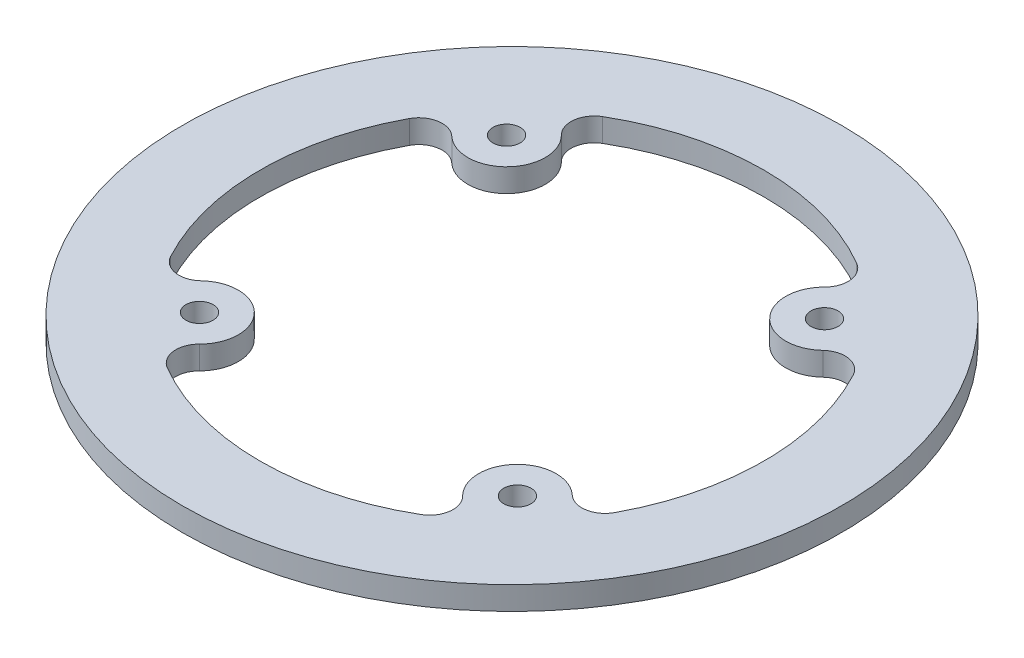
ISO-10303-21;
HEADER;
FILE_DESCRIPTION(('STEP AP214'),'2;1');
FILE_NAME('part.step','',(''),(''),'','','');
FILE_SCHEMA(('AUTOMOTIVE_DESIGN { 1 0 10303 214 1 1 1 1 }'));
ENDSEC;
DATA;
#1=APPLICATION_CONTEXT('core data for automotive mechanical design processes');
#2=APPLICATION_PROTOCOL_DEFINITION('international standard','automotive_design',2000,#1);
#3=PRODUCT_CONTEXT('',#1,'mechanical');
#4=PRODUCT('Part','Part','',(#3));
#5=PRODUCT_RELATED_PRODUCT_CATEGORY('part','',(#4));
#6=PRODUCT_DEFINITION_FORMATION('','',#4);
#7=PRODUCT_DEFINITION_CONTEXT('part definition',#1,'design');
#8=PRODUCT_DEFINITION('design','',#6,#7);
#9=PRODUCT_DEFINITION_SHAPE('','',#8);
#10=(LENGTH_UNIT() NAMED_UNIT(*) SI_UNIT(.MILLI.,.METRE.));
#11=(NAMED_UNIT(*) PLANE_ANGLE_UNIT() SI_UNIT($,.RADIAN.));
#12=(NAMED_UNIT(*) SI_UNIT($,.STERADIAN.) SOLID_ANGLE_UNIT());
#13=UNCERTAINTY_MEASURE_WITH_UNIT(LENGTH_MEASURE(1.E-05),#10,'distance_accuracy_value','');
#14=(GEOMETRIC_REPRESENTATION_CONTEXT(3) GLOBAL_UNCERTAINTY_ASSIGNED_CONTEXT((#13)) GLOBAL_UNIT_ASSIGNED_CONTEXT((#10,
#11,#12)) REPRESENTATION_CONTEXT('',''));
#15=CARTESIAN_POINT('',(0.,0.,0.));
#16=DIRECTION('',(0.,0.,1.));
#17=DIRECTION('',(1.,0.,0.));
#18=AXIS2_PLACEMENT_3D('',#15,#16,#17);
#19=CARTESIAN_POINT('',(0.,3.,0.));
#20=DIRECTION('',(0.,1.,0.));
#21=DIRECTION('',(0.,0.,1.));
#22=AXIS2_PLACEMENT_3D('',#19,#20,#21);
#23=PLANE('',#22);
#24=CARTESIAN_POINT('',(20.5,3.,-19.7989898732233));
#25=DIRECTION('',(0.,1.,0.));
#26=DIRECTION('',(0.,0.,1.));
#27=AXIS2_PLACEMENT_3D('',#24,#25,#26);
#28=CIRCLE('',#27,1.75);
#29=CARTESIAN_POINT('',(20.5,3.,-18.0489898732233));
#30=VERTEX_POINT('',#29);
#31=EDGE_CURVE('E267',#30,#30,#28,.T.);
#32=ORIENTED_EDGE('',*,*,#31,.F.);
#33=EDGE_LOOP('',(#32));
#34=FACE_BOUND('',#33,.T.);
#35=CARTESIAN_POINT('',(-20.5,3.,19.7989898732233));
#36=DIRECTION('',(0.,1.,0.));
#37=DIRECTION('',(0.,0.,1.));
#38=AXIS2_PLACEMENT_3D('',#35,#36,#37);
#39=CIRCLE('',#38,1.75);
#40=CARTESIAN_POINT('',(-20.5,3.,21.5489898732233));
#41=VERTEX_POINT('',#40);
#42=EDGE_CURVE('E252',#41,#41,#39,.T.);
#43=ORIENTED_EDGE('',*,*,#42,.F.);
#44=EDGE_LOOP('',(#43));
#45=FACE_BOUND('',#44,.T.);
#46=CARTESIAN_POINT('',(0.,3.,0.));
#47=DIRECTION('',(0.,1.,0.));
#48=DIRECTION('',(0.,0.,1.));
#49=AXIS2_PLACEMENT_3D('',#46,#47,#48);
#50=CIRCLE('',#49,42.5);
#51=CARTESIAN_POINT('',(0.,3.,42.5));
#52=VERTEX_POINT('',#51);
#53=EDGE_CURVE('E182',#52,#52,#50,.T.);
#54=ORIENTED_EDGE('',*,*,#53,.T.);
#55=EDGE_LOOP('',(#54));
#56=FACE_BOUND('',#55,.T.);
#57=CARTESIAN_POINT('',(20.5,3.,19.7989898732233));
#58=DIRECTION('',(0.,1.,0.));
#59=DIRECTION('',(0.,0.,1.));
#60=AXIS2_PLACEMENT_3D('',#57,#58,#59);
#61=CIRCLE('',#60,1.75);
#62=CARTESIAN_POINT('',(20.5,3.,21.5489898732233));
#63=VERTEX_POINT('',#62);
#64=EDGE_CURVE('E258',#63,#63,#61,.T.);
#65=ORIENTED_EDGE('',*,*,#64,.F.);
#66=EDGE_LOOP('',(#65));
#67=FACE_BOUND('',#66,.T.);
#68=CARTESIAN_POINT('',(-20.5,3.,-19.7989898732233));
#69=DIRECTION('',(0.,1.,0.));
#70=DIRECTION('',(0.,0.,1.));
#71=AXIS2_PLACEMENT_3D('',#68,#69,#70);
#72=CIRCLE('',#71,1.75);
#73=CARTESIAN_POINT('',(-20.5,3.,-18.0489898732233));
#74=VERTEX_POINT('',#73);
#75=EDGE_CURVE('E259',#74,#74,#72,.T.);
#76=ORIENTED_EDGE('',*,*,#75,.F.);
#77=EDGE_LOOP('',(#76));
#78=FACE_BOUND('',#77,.T.);
#79=CARTESIAN_POINT('',(0.,3.,0.));
#80=DIRECTION('',(0.,1.,0.));
#81=DIRECTION('',(0.,0.,1.));
#82=AXIS2_PLACEMENT_3D('',#79,#80,#81);
#83=CIRCLE('',#82,32.5);
#84=CARTESIAN_POINT('',(16.3790683172023,3.,-28.0709123660137));
#85=VERTEX_POINT('',#84);
#86=CARTESIAN_POINT('',(-16.3790683172023,3.,-28.0709123660137));
#87=VERTEX_POINT('',#86);
#88=EDGE_CURVE('E166',#85,#87,#83,.T.);
#89=ORIENTED_EDGE('',*,*,#88,.F.);
#90=CARTESIAN_POINT('',(14.8671543186913,3.,-25.4797512245355));
#91=DIRECTION('',(0.,1.,0.));
#92=DIRECTION('',(0.,0.,1.));
#93=AXIS2_PLACEMENT_3D('',#90,#91,#92);
#94=CIRCLE('',#93,3.);
#95=CARTESIAN_POINT('',(16.9794714491821,3.,-23.3494657177934));
#96=VERTEX_POINT('',#95);
#97=EDGE_CURVE('E163',#85,#96,#94,.F.);
#98=ORIENTED_EDGE('',*,*,#97,.T.);
#99=CARTESIAN_POINT('',(20.5,3.,-19.7989898732233));
#100=DIRECTION('',(0.,1.,0.));
#101=DIRECTION('',(0.,0.,1.));
#102=AXIS2_PLACEMENT_3D('',#99,#100,#101);
#103=CIRCLE('',#102,5.);
#104=CARTESIAN_POINT('',(23.9258840448161,3.,-16.1571059498295));
#105=VERTEX_POINT('',#104);
#106=EDGE_CURVE('E165',#96,#105,#103,.T.);
#107=ORIENTED_EDGE('',*,*,#106,.T.);
#108=CARTESIAN_POINT('',(25.9814144717057,3.,-13.9719755957932));
#109=DIRECTION('',(0.,1.,0.));
#110=DIRECTION('',(0.,0.,1.));
#111=AXIS2_PLACEMENT_3D('',#108,#109,#110);
#112=CIRCLE('',#111,3.);
#113=CARTESIAN_POINT('',(28.6235922145911,3.,-15.3928544699416));
#114=VERTEX_POINT('',#113);
#115=EDGE_CURVE('E225',#105,#114,#112,.F.);
#116=ORIENTED_EDGE('',*,*,#115,.T.);
#117=CARTESIAN_POINT('',(28.6235922145911,3.,15.3928544699416));
#118=VERTEX_POINT('',#117);
#119=EDGE_CURVE('E349',#118,#114,#83,.T.);
#120=ORIENTED_EDGE('',*,*,#119,.F.);
#121=CARTESIAN_POINT('',(25.9814144717057,3.,13.9719755957932));
#122=DIRECTION('',(0.,1.,0.));
#123=DIRECTION('',(0.,0.,1.));
#124=AXIS2_PLACEMENT_3D('',#121,#122,#123);
#125=CIRCLE('',#124,3.);
#126=CARTESIAN_POINT('',(23.9258840448161,3.,16.1571059498295));
#127=VERTEX_POINT('',#126);
#128=EDGE_CURVE('E229',#118,#127,#125,.F.);
#129=ORIENTED_EDGE('',*,*,#128,.T.);
#130=CARTESIAN_POINT('',(20.5,3.,19.7989898732233));
#131=DIRECTION('',(0.,1.,0.));
#132=DIRECTION('',(0.,0.,1.));
#133=AXIS2_PLACEMENT_3D('',#130,#131,#132);
#134=CIRCLE('',#133,5.);
#135=CARTESIAN_POINT('',(16.9794714491821,3.,23.3494657177934));
#136=VERTEX_POINT('',#135);
#137=EDGE_CURVE('E190',#127,#136,#134,.T.);
#138=ORIENTED_EDGE('',*,*,#137,.T.);
#139=CARTESIAN_POINT('',(14.8671543186913,3.,25.4797512245355));
#140=DIRECTION('',(0.,1.,0.));
#141=DIRECTION('',(0.,0.,1.));
#142=AXIS2_PLACEMENT_3D('',#139,#140,#141);
#143=CIRCLE('',#142,3.);
#144=CARTESIAN_POINT('',(16.3790683172023,3.,28.0709123660137));
#145=VERTEX_POINT('',#144);
#146=EDGE_CURVE('E233',#136,#145,#143,.F.);
#147=ORIENTED_EDGE('',*,*,#146,.T.);
#148=CARTESIAN_POINT('',(-16.3790683172023,3.,28.0709123660137));
#149=VERTEX_POINT('',#148);
#150=EDGE_CURVE('E356',#149,#145,#83,.T.);
#151=ORIENTED_EDGE('',*,*,#150,.F.);
#152=CARTESIAN_POINT('',(-14.8671543186913,3.,25.4797512245355));
#153=DIRECTION('',(0.,1.,0.));
#154=DIRECTION('',(0.,0.,1.));
#155=AXIS2_PLACEMENT_3D('',#152,#153,#154);
#156=CIRCLE('',#155,3.);
#157=CARTESIAN_POINT('',(-16.9794714491821,3.,23.3494657177934));
#158=VERTEX_POINT('',#157);
#159=EDGE_CURVE('E237',#149,#158,#156,.F.);
#160=ORIENTED_EDGE('',*,*,#159,.T.);
#161=CARTESIAN_POINT('',(-20.5,3.,19.7989898732233));
#162=DIRECTION('',(0.,1.,0.));
#163=DIRECTION('',(0.,0.,1.));
#164=AXIS2_PLACEMENT_3D('',#161,#162,#163);
#165=CIRCLE('',#164,5.);
#166=CARTESIAN_POINT('',(-23.9258840448161,3.,16.1571059498295));
#167=VERTEX_POINT('',#166);
#168=EDGE_CURVE('E370',#158,#167,#165,.T.);
#169=ORIENTED_EDGE('',*,*,#168,.T.);
#170=CARTESIAN_POINT('',(-25.9814144717057,3.,13.9719755957932));
#171=DIRECTION('',(0.,1.,0.));
#172=DIRECTION('',(0.,0.,1.));
#173=AXIS2_PLACEMENT_3D('',#170,#171,#172);
#174=CIRCLE('',#173,3.);
#175=CARTESIAN_POINT('',(-28.6235922145911,3.,15.3928544699416));
#176=VERTEX_POINT('',#175);
#177=EDGE_CURVE('E241',#167,#176,#174,.F.);
#178=ORIENTED_EDGE('',*,*,#177,.T.);
#179=CARTESIAN_POINT('',(-28.6235922145911,3.,-15.3928544699416));
#180=VERTEX_POINT('',#179);
#181=EDGE_CURVE('E368',#180,#176,#83,.T.);
#182=ORIENTED_EDGE('',*,*,#181,.F.);
#183=CARTESIAN_POINT('',(-25.9814144717057,3.,-13.9719755957932));
#184=DIRECTION('',(0.,1.,0.));
#185=DIRECTION('',(0.,0.,1.));
#186=AXIS2_PLACEMENT_3D('',#183,#184,#185);
#187=CIRCLE('',#186,3.);
#188=CARTESIAN_POINT('',(-23.9258840448161,3.,-16.1571059498295));
#189=VERTEX_POINT('',#188);
#190=EDGE_CURVE('E56',#180,#189,#187,.F.);
#191=ORIENTED_EDGE('',*,*,#190,.T.);
#192=CARTESIAN_POINT('',(-20.5,3.,-19.7989898732233));
#193=DIRECTION('',(0.,1.,0.));
#194=DIRECTION('',(0.,0.,1.));
#195=AXIS2_PLACEMENT_3D('',#192,#193,#194);
#196=CIRCLE('',#195,5.);
#197=CARTESIAN_POINT('',(-16.9794714491821,3.,-23.3494657177934));
#198=VERTEX_POINT('',#197);
#199=EDGE_CURVE('E367',#189,#198,#196,.T.);
#200=ORIENTED_EDGE('',*,*,#199,.T.);
#201=CARTESIAN_POINT('',(-14.8671543186913,3.,-25.4797512245355));
#202=DIRECTION('',(0.,1.,0.));
#203=DIRECTION('',(0.,0.,1.));
#204=AXIS2_PLACEMENT_3D('',#201,#202,#203);
#205=CIRCLE('',#204,3.);
#206=EDGE_CURVE('E245',#198,#87,#205,.F.);
#207=ORIENTED_EDGE('',*,*,#206,.T.);
#208=EDGE_LOOP('',(#89,#98,#107,#116,#120,#129,#138,#147,#151,#160,#169,#178,#182,#191,#200,#207));
#209=FACE_BOUND('',#208,.T.);
#210=ADVANCED_FACE('F47',(#34,#45,#56,#67,#78,#209),#23,.T.);
#211=CARTESIAN_POINT('',(0.,0.,0.));
#212=DIRECTION('',(0.,1.,0.));
#213=DIRECTION('',(0.,0.,1.));
#214=AXIS2_PLACEMENT_3D('',#211,#212,#213);
#215=PLANE('',#214);
#216=CARTESIAN_POINT('',(-20.5,0.,-19.7989898732233));
#217=DIRECTION('',(0.,1.,0.));
#218=DIRECTION('',(0.,0.,1.));
#219=AXIS2_PLACEMENT_3D('',#216,#217,#218);
#220=CIRCLE('',#219,1.75);
#221=CARTESIAN_POINT('',(-20.5,0.,-18.0489898732233));
#222=VERTEX_POINT('',#221);
#223=EDGE_CURVE('E263',#222,#222,#220,.T.);
#224=ORIENTED_EDGE('',*,*,#223,.T.);
#225=EDGE_LOOP('',(#224));
#226=FACE_BOUND('',#225,.T.);
#227=CARTESIAN_POINT('',(20.5,0.,-19.7989898732233));
#228=DIRECTION('',(0.,1.,0.));
#229=DIRECTION('',(0.,0.,1.));
#230=AXIS2_PLACEMENT_3D('',#227,#228,#229);
#231=CIRCLE('',#230,1.75);
#232=CARTESIAN_POINT('',(20.5,0.,-18.0489898732233));
#233=VERTEX_POINT('',#232);
#234=EDGE_CURVE('E262',#233,#233,#231,.T.);
#235=ORIENTED_EDGE('',*,*,#234,.T.);
#236=EDGE_LOOP('',(#235));
#237=FACE_BOUND('',#236,.T.);
#238=CARTESIAN_POINT('',(20.5,0.,19.7989898732233));
#239=DIRECTION('',(0.,1.,0.));
#240=DIRECTION('',(0.,0.,1.));
#241=AXIS2_PLACEMENT_3D('',#238,#239,#240);
#242=CIRCLE('',#241,1.75);
#243=CARTESIAN_POINT('',(20.5,0.,21.5489898732233));
#244=VERTEX_POINT('',#243);
#245=EDGE_CURVE('E51',#244,#244,#242,.T.);
#246=ORIENTED_EDGE('',*,*,#245,.T.);
#247=EDGE_LOOP('',(#246));
#248=FACE_BOUND('',#247,.T.);
#249=CARTESIAN_POINT('',(-20.5,0.,19.7989898732233));
#250=DIRECTION('',(0.,1.,0.));
#251=DIRECTION('',(0.,0.,1.));
#252=AXIS2_PLACEMENT_3D('',#249,#250,#251);
#253=CIRCLE('',#252,1.75);
#254=CARTESIAN_POINT('',(-20.5,0.,21.5489898732233));
#255=VERTEX_POINT('',#254);
#256=EDGE_CURVE('E255',#255,#255,#253,.T.);
#257=ORIENTED_EDGE('',*,*,#256,.T.);
#258=EDGE_LOOP('',(#257));
#259=FACE_BOUND('',#258,.T.);
#260=CARTESIAN_POINT('',(0.,0.,0.));
#261=DIRECTION('',(0.,1.,0.));
#262=DIRECTION('',(0.,0.,1.));
#263=AXIS2_PLACEMENT_3D('',#260,#261,#262);
#264=CIRCLE('',#263,42.5);
#265=CARTESIAN_POINT('',(0.,0.,42.5));
#266=VERTEX_POINT('',#265);
#267=EDGE_CURVE('E187',#266,#266,#264,.T.);
#268=ORIENTED_EDGE('',*,*,#267,.F.);
#269=EDGE_LOOP('',(#268));
#270=FACE_BOUND('',#269,.T.);
#271=CARTESIAN_POINT('',(20.5,0.,-19.7989898732233));
#272=DIRECTION('',(0.,1.,0.));
#273=DIRECTION('',(0.,0.,1.));
#274=AXIS2_PLACEMENT_3D('',#271,#272,#273);
#275=CIRCLE('',#274,5.);
#276=CARTESIAN_POINT('',(16.9794714491821,0.,-23.3494657177934));
#277=VERTEX_POINT('',#276);
#278=CARTESIAN_POINT('',(23.9258840448161,0.,-16.1571059498295));
#279=VERTEX_POINT('',#278);
#280=EDGE_CURVE('E345',#277,#279,#275,.T.);
#281=ORIENTED_EDGE('',*,*,#280,.F.);
#282=CARTESIAN_POINT('',(14.8671543186913,0.,-25.4797512245355));
#283=DIRECTION('',(0.,1.,0.));
#284=DIRECTION('',(0.,0.,1.));
#285=AXIS2_PLACEMENT_3D('',#282,#283,#284);
#286=CIRCLE('',#285,3.);
#287=CARTESIAN_POINT('',(16.3790683172023,0.,-28.0709123660137));
#288=VERTEX_POINT('',#287);
#289=EDGE_CURVE('E71',#277,#288,#286,.T.);
#290=ORIENTED_EDGE('',*,*,#289,.T.);
#291=CARTESIAN_POINT('',(0.,0.,0.));
#292=DIRECTION('',(0.,1.,0.));
#293=DIRECTION('',(0.,0.,1.));
#294=AXIS2_PLACEMENT_3D('',#291,#292,#293);
#295=CIRCLE('',#294,32.5);
#296=CARTESIAN_POINT('',(-16.3790683172023,0.,-28.0709123660137));
#297=VERTEX_POINT('',#296);
#298=EDGE_CURVE('E348',#288,#297,#295,.T.);
#299=ORIENTED_EDGE('',*,*,#298,.T.);
#300=CARTESIAN_POINT('',(-14.8671543186913,0.,-25.4797512245355));
#301=DIRECTION('',(0.,1.,0.));
#302=DIRECTION('',(0.,0.,1.));
#303=AXIS2_PLACEMENT_3D('',#300,#301,#302);
#304=CIRCLE('',#303,3.);
#305=CARTESIAN_POINT('',(-16.9794714491821,0.,-23.3494657177934));
#306=VERTEX_POINT('',#305);
#307=EDGE_CURVE('E171',#297,#306,#304,.T.);
#308=ORIENTED_EDGE('',*,*,#307,.T.);
#309=CARTESIAN_POINT('',(-20.5,0.,-19.7989898732233));
#310=DIRECTION('',(0.,1.,0.));
#311=DIRECTION('',(0.,0.,1.));
#312=AXIS2_PLACEMENT_3D('',#309,#310,#311);
#313=CIRCLE('',#312,5.);
#314=CARTESIAN_POINT('',(-23.9258840448161,0.,-16.1571059498295));
#315=VERTEX_POINT('',#314);
#316=EDGE_CURVE('E351',#315,#306,#313,.T.);
#317=ORIENTED_EDGE('',*,*,#316,.F.);
#318=CARTESIAN_POINT('',(-25.9814144717057,0.,-13.9719755957932));
#319=DIRECTION('',(0.,1.,0.));
#320=DIRECTION('',(0.,0.,1.));
#321=AXIS2_PLACEMENT_3D('',#318,#319,#320);
#322=CIRCLE('',#321,3.);
#323=CARTESIAN_POINT('',(-28.6235922145911,0.,-15.3928544699416));
#324=VERTEX_POINT('',#323);
#325=EDGE_CURVE('E12',#315,#324,#322,.T.);
#326=ORIENTED_EDGE('',*,*,#325,.T.);
#327=CARTESIAN_POINT('',(-28.6235922145911,0.,15.3928544699416));
#328=VERTEX_POINT('',#327);
#329=EDGE_CURVE('E353',#324,#328,#295,.T.);
#330=ORIENTED_EDGE('',*,*,#329,.T.);
#331=CARTESIAN_POINT('',(-25.9814144717057,0.,13.9719755957932));
#332=DIRECTION('',(0.,1.,0.));
#333=DIRECTION('',(0.,0.,1.));
#334=AXIS2_PLACEMENT_3D('',#331,#332,#333);
#335=CIRCLE('',#334,3.);
#336=CARTESIAN_POINT('',(-23.9258840448161,0.,16.1571059498295));
#337=VERTEX_POINT('',#336);
#338=EDGE_CURVE('E243',#328,#337,#335,.T.);
#339=ORIENTED_EDGE('',*,*,#338,.T.);
#340=CARTESIAN_POINT('',(-20.5,0.,19.7989898732233));
#341=DIRECTION('',(0.,1.,0.));
#342=DIRECTION('',(0.,0.,1.));
#343=AXIS2_PLACEMENT_3D('',#340,#341,#342);
#344=CIRCLE('',#343,5.);
#345=CARTESIAN_POINT('',(-16.9794714491821,0.,23.3494657177934));
#346=VERTEX_POINT('',#345);
#347=EDGE_CURVE('E360',#346,#337,#344,.T.);
#348=ORIENTED_EDGE('',*,*,#347,.F.);
#349=CARTESIAN_POINT('',(-14.8671543186913,0.,25.4797512245355));
#350=DIRECTION('',(0.,1.,0.));
#351=DIRECTION('',(0.,0.,1.));
#352=AXIS2_PLACEMENT_3D('',#349,#350,#351);
#353=CIRCLE('',#352,3.);
#354=CARTESIAN_POINT('',(-16.3790683172023,0.,28.0709123660137));
#355=VERTEX_POINT('',#354);
#356=EDGE_CURVE('E239',#346,#355,#353,.T.);
#357=ORIENTED_EDGE('',*,*,#356,.T.);
#358=CARTESIAN_POINT('',(16.3790683172023,0.,28.0709123660137));
#359=VERTEX_POINT('',#358);
#360=EDGE_CURVE('E363',#355,#359,#295,.T.);
#361=ORIENTED_EDGE('',*,*,#360,.T.);
#362=CARTESIAN_POINT('',(14.8671543186913,0.,25.4797512245355));
#363=DIRECTION('',(0.,1.,0.));
#364=DIRECTION('',(0.,0.,1.));
#365=AXIS2_PLACEMENT_3D('',#362,#363,#364);
#366=CIRCLE('',#365,3.);
#367=CARTESIAN_POINT('',(16.9794714491821,0.,23.3494657177934));
#368=VERTEX_POINT('',#367);
#369=EDGE_CURVE('E235',#359,#368,#366,.T.);
#370=ORIENTED_EDGE('',*,*,#369,.T.);
#371=CARTESIAN_POINT('',(20.5,0.,19.7989898732233));
#372=DIRECTION('',(0.,1.,0.));
#373=DIRECTION('',(0.,0.,1.));
#374=AXIS2_PLACEMENT_3D('',#371,#372,#373);
#375=CIRCLE('',#374,5.);
#376=CARTESIAN_POINT('',(23.9258840448161,0.,16.1571059498295));
#377=VERTEX_POINT('',#376);
#378=EDGE_CURVE('E364',#377,#368,#375,.T.);
#379=ORIENTED_EDGE('',*,*,#378,.F.);
#380=CARTESIAN_POINT('',(25.9814144717057,0.,13.9719755957932));
#381=DIRECTION('',(0.,1.,0.));
#382=DIRECTION('',(0.,0.,1.));
#383=AXIS2_PLACEMENT_3D('',#380,#381,#382);
#384=CIRCLE('',#383,3.);
#385=CARTESIAN_POINT('',(28.6235922145911,0.,15.3928544699416));
#386=VERTEX_POINT('',#385);
#387=EDGE_CURVE('E231',#377,#386,#384,.T.);
#388=ORIENTED_EDGE('',*,*,#387,.T.);
#389=CARTESIAN_POINT('',(28.6235922145911,0.,-15.3928544699416));
#390=VERTEX_POINT('',#389);
#391=EDGE_CURVE('E266',#386,#390,#295,.T.);
#392=ORIENTED_EDGE('',*,*,#391,.T.);
#393=CARTESIAN_POINT('',(25.9814144717057,0.,-13.9719755957932));
#394=DIRECTION('',(0.,1.,0.));
#395=DIRECTION('',(0.,0.,1.));
#396=AXIS2_PLACEMENT_3D('',#393,#394,#395);
#397=CIRCLE('',#396,3.);
#398=EDGE_CURVE('E227',#390,#279,#397,.T.);
#399=ORIENTED_EDGE('',*,*,#398,.T.);
#400=EDGE_LOOP('',(#281,#290,#299,#308,#317,#326,#330,#339,#348,#357,#361,#370,#379,#388,#392,#399));
#401=FACE_BOUND('',#400,.T.);
#402=ADVANCED_FACE('F277',(#226,#237,#248,#259,#270,#401),#215,.F.);
#403=CARTESIAN_POINT('',(0.,3.,0.));
#404=DIRECTION('',(0.,-1.,0.));
#405=DIRECTION('',(0.,0.,-1.));
#406=AXIS2_PLACEMENT_3D('',#403,#404,#405);
#407=CYLINDRICAL_SURFACE('',#406,42.5);
#408=ORIENTED_EDGE('',*,*,#53,.F.);
#409=EDGE_LOOP('',(#408));
#410=FACE_BOUND('',#409,.T.);
#411=ORIENTED_EDGE('',*,*,#267,.T.);
#412=EDGE_LOOP('',(#411));
#413=FACE_BOUND('',#412,.T.);
#414=ADVANCED_FACE('F290',(#410,#413),#407,.T.);
#415=CARTESIAN_POINT('',(-20.5,3.,19.7989898732233));
#416=DIRECTION('',(0.,-1.,0.));
#417=DIRECTION('',(0.,0.,-1.));
#418=AXIS2_PLACEMENT_3D('',#415,#416,#417);
#419=CYLINDRICAL_SURFACE('',#418,1.75);
#420=ORIENTED_EDGE('',*,*,#42,.T.);
#421=EDGE_LOOP('',(#420));
#422=FACE_BOUND('',#421,.T.);
#423=ORIENTED_EDGE('',*,*,#256,.F.);
#424=EDGE_LOOP('',(#423));
#425=FACE_BOUND('',#424,.T.);
#426=ADVANCED_FACE('F283',(#422,#425),#419,.F.);
#427=CARTESIAN_POINT('',(20.5,3.,19.7989898732233));
#428=DIRECTION('',(0.,-1.,0.));
#429=DIRECTION('',(0.,0.,-1.));
#430=AXIS2_PLACEMENT_3D('',#427,#428,#429);
#431=CYLINDRICAL_SURFACE('',#430,1.75);
#432=ORIENTED_EDGE('',*,*,#64,.T.);
#433=EDGE_LOOP('',(#432));
#434=FACE_BOUND('',#433,.T.);
#435=ORIENTED_EDGE('',*,*,#245,.F.);
#436=EDGE_LOOP('',(#435));
#437=FACE_BOUND('',#436,.T.);
#438=ADVANCED_FACE('F280',(#434,#437),#431,.F.);
#439=CARTESIAN_POINT('',(20.5,3.,-19.7989898732233));
#440=DIRECTION('',(0.,-1.,0.));
#441=DIRECTION('',(0.,0.,-1.));
#442=AXIS2_PLACEMENT_3D('',#439,#440,#441);
#443=CYLINDRICAL_SURFACE('',#442,1.75);
#444=ORIENTED_EDGE('',*,*,#31,.T.);
#445=EDGE_LOOP('',(#444));
#446=FACE_BOUND('',#445,.T.);
#447=ORIENTED_EDGE('',*,*,#234,.F.);
#448=EDGE_LOOP('',(#447));
#449=FACE_BOUND('',#448,.T.);
#450=ADVANCED_FACE('F282',(#446,#449),#443,.F.);
#451=CARTESIAN_POINT('',(-20.5,3.,-19.7989898732233));
#452=DIRECTION('',(0.,-1.,0.));
#453=DIRECTION('',(0.,0.,-1.));
#454=AXIS2_PLACEMENT_3D('',#451,#452,#453);
#455=CYLINDRICAL_SURFACE('',#454,1.75);
#456=ORIENTED_EDGE('',*,*,#75,.T.);
#457=EDGE_LOOP('',(#456));
#458=FACE_BOUND('',#457,.T.);
#459=ORIENTED_EDGE('',*,*,#223,.F.);
#460=EDGE_LOOP('',(#459));
#461=FACE_BOUND('',#460,.T.);
#462=ADVANCED_FACE('F49',(#458,#461),#455,.F.);
#463=CARTESIAN_POINT('',(20.5,0.,-19.7989898732233));
#464=DIRECTION('',(0.,1.,0.));
#465=DIRECTION('',(0.,0.,1.));
#466=AXIS2_PLACEMENT_3D('',#463,#464,#465);
#467=CYLINDRICAL_SURFACE('',#466,5.);
#468=ORIENTED_EDGE('',*,*,#280,.T.);
#469=DIRECTION('',(0.,1.,0.));
#470=VECTOR('',#469,1.);
#471=CARTESIAN_POINT('',(23.9258840448161,0.,-16.1571059498295));
#472=LINE('',#471,#470);
#473=EDGE_CURVE('E179',#279,#105,#472,.T.);
#474=ORIENTED_EDGE('',*,*,#473,.T.);
#475=ORIENTED_EDGE('',*,*,#106,.F.);
#476=DIRECTION('',(0.,1.,0.));
#477=VECTOR('',#476,1.);
#478=CARTESIAN_POINT('',(16.9794714491821,0.,-23.3494657177934));
#479=LINE('',#478,#477);
#480=EDGE_CURVE('E177',#96,#277,#479,.F.);
#481=ORIENTED_EDGE('',*,*,#480,.T.);
#482=EDGE_LOOP('',(#468,#474,#475,#481));
#483=FACE_BOUND('',#482,.T.);
#484=ADVANCED_FACE('F176',(#483),#467,.T.);
#485=CARTESIAN_POINT('',(0.,0.,0.));
#486=DIRECTION('',(0.,1.,0.));
#487=DIRECTION('',(0.,0.,1.));
#488=AXIS2_PLACEMENT_3D('',#485,#486,#487);
#489=CYLINDRICAL_SURFACE('',#488,32.5);
#490=ORIENTED_EDGE('',*,*,#119,.T.);
#491=DIRECTION('',(0.,1.,0.));
#492=VECTOR('',#491,1.);
#493=CARTESIAN_POINT('',(28.6235922145911,0.,-15.3928544699416));
#494=LINE('',#493,#492);
#495=EDGE_CURVE('E195',#114,#390,#494,.F.);
#496=ORIENTED_EDGE('',*,*,#495,.T.);
#497=ORIENTED_EDGE('',*,*,#391,.F.);
#498=DIRECTION('',(0.,1.,0.));
#499=VECTOR('',#498,1.);
#500=CARTESIAN_POINT('',(28.6235922145911,0.,15.3928544699416));
#501=LINE('',#500,#499);
#502=EDGE_CURVE('E184',#386,#118,#501,.T.);
#503=ORIENTED_EDGE('',*,*,#502,.T.);
#504=EDGE_LOOP('',(#490,#496,#497,#503));
#505=FACE_BOUND('',#504,.T.);
#506=ADVANCED_FACE('F404',(#505),#489,.F.);
#507=CARTESIAN_POINT('',(20.5,0.,19.7989898732233));
#508=DIRECTION('',(0.,1.,0.));
#509=DIRECTION('',(0.,0.,1.));
#510=AXIS2_PLACEMENT_3D('',#507,#508,#509);
#511=CYLINDRICAL_SURFACE('',#510,5.);
#512=ORIENTED_EDGE('',*,*,#137,.F.);
#513=DIRECTION('',(0.,1.,0.));
#514=VECTOR('',#513,1.);
#515=CARTESIAN_POINT('',(23.9258840448161,0.,16.1571059498295));
#516=LINE('',#515,#514);
#517=EDGE_CURVE('E200',#127,#377,#516,.F.);
#518=ORIENTED_EDGE('',*,*,#517,.T.);
#519=ORIENTED_EDGE('',*,*,#378,.T.);
#520=DIRECTION('',(0.,1.,0.));
#521=VECTOR('',#520,1.);
#522=CARTESIAN_POINT('',(16.9794714491821,0.,23.3494657177934));
#523=LINE('',#522,#521);
#524=EDGE_CURVE('E197',#368,#136,#523,.T.);
#525=ORIENTED_EDGE('',*,*,#524,.T.);
#526=EDGE_LOOP('',(#512,#518,#519,#525));
#527=FACE_BOUND('',#526,.T.);
#528=ADVANCED_FACE('F409',(#527),#511,.T.);
#529=ORIENTED_EDGE('',*,*,#150,.T.);
#530=DIRECTION('',(0.,1.,0.));
#531=VECTOR('',#530,1.);
#532=CARTESIAN_POINT('',(16.3790683172023,0.,28.0709123660137));
#533=LINE('',#532,#531);
#534=EDGE_CURVE('E205',#145,#359,#533,.F.);
#535=ORIENTED_EDGE('',*,*,#534,.T.);
#536=ORIENTED_EDGE('',*,*,#360,.F.);
#537=DIRECTION('',(0.,1.,0.));
#538=VECTOR('',#537,1.);
#539=CARTESIAN_POINT('',(-16.3790683172023,0.,28.0709123660137));
#540=LINE('',#539,#538);
#541=EDGE_CURVE('E202',#355,#149,#540,.T.);
#542=ORIENTED_EDGE('',*,*,#541,.T.);
#543=EDGE_LOOP('',(#529,#535,#536,#542));
#544=FACE_BOUND('',#543,.T.);
#545=ADVANCED_FACE('F394',(#544),#489,.F.);
#546=CARTESIAN_POINT('',(-20.5,0.,19.7989898732233));
#547=DIRECTION('',(0.,1.,0.));
#548=DIRECTION('',(0.,0.,1.));
#549=AXIS2_PLACEMENT_3D('',#546,#547,#548);
#550=CYLINDRICAL_SURFACE('',#549,5.);
#551=ORIENTED_EDGE('',*,*,#168,.F.);
#552=DIRECTION('',(0.,1.,0.));
#553=VECTOR('',#552,1.);
#554=CARTESIAN_POINT('',(-16.9794714491821,0.,23.3494657177934));
#555=LINE('',#554,#553);
#556=EDGE_CURVE('E210',#158,#346,#555,.F.);
#557=ORIENTED_EDGE('',*,*,#556,.T.);
#558=ORIENTED_EDGE('',*,*,#347,.T.);
#559=DIRECTION('',(0.,1.,0.));
#560=VECTOR('',#559,1.);
#561=CARTESIAN_POINT('',(-23.9258840448161,0.,16.1571059498295));
#562=LINE('',#561,#560);
#563=EDGE_CURVE('E207',#337,#167,#562,.T.);
#564=ORIENTED_EDGE('',*,*,#563,.T.);
#565=EDGE_LOOP('',(#551,#557,#558,#564));
#566=FACE_BOUND('',#565,.T.);
#567=ADVANCED_FACE('F387',(#566),#550,.T.);
#568=ORIENTED_EDGE('',*,*,#181,.T.);
#569=DIRECTION('',(0.,1.,0.));
#570=VECTOR('',#569,1.);
#571=CARTESIAN_POINT('',(-28.6235922145911,0.,15.3928544699416));
#572=LINE('',#571,#570);
#573=EDGE_CURVE('E215',#176,#328,#572,.F.);
#574=ORIENTED_EDGE('',*,*,#573,.T.);
#575=ORIENTED_EDGE('',*,*,#329,.F.);
#576=DIRECTION('',(0.,1.,0.));
#577=VECTOR('',#576,1.);
#578=CARTESIAN_POINT('',(-28.6235922145911,0.,-15.3928544699416));
#579=LINE('',#578,#577);
#580=EDGE_CURVE('E212',#324,#180,#579,.T.);
#581=ORIENTED_EDGE('',*,*,#580,.T.);
#582=EDGE_LOOP('',(#568,#574,#575,#581));
#583=FACE_BOUND('',#582,.T.);
#584=ADVANCED_FACE('F378',(#583),#489,.F.);
#585=CARTESIAN_POINT('',(-20.5,0.,-19.7989898732233));
#586=DIRECTION('',(0.,1.,0.));
#587=DIRECTION('',(0.,0.,1.));
#588=AXIS2_PLACEMENT_3D('',#585,#586,#587);
#589=CYLINDRICAL_SURFACE('',#588,5.);
#590=ORIENTED_EDGE('',*,*,#316,.T.);
#591=DIRECTION('',(0.,1.,0.));
#592=VECTOR('',#591,1.);
#593=CARTESIAN_POINT('',(-16.9794714491821,0.,-23.3494657177934));
#594=LINE('',#593,#592);
#595=EDGE_CURVE('E219',#306,#198,#594,.T.);
#596=ORIENTED_EDGE('',*,*,#595,.T.);
#597=ORIENTED_EDGE('',*,*,#199,.F.);
#598=DIRECTION('',(0.,1.,0.));
#599=VECTOR('',#598,1.);
#600=CARTESIAN_POINT('',(-23.9258840448161,0.,-16.1571059498295));
#601=LINE('',#600,#599);
#602=EDGE_CURVE('E217',#189,#315,#601,.F.);
#603=ORIENTED_EDGE('',*,*,#602,.T.);
#604=EDGE_LOOP('',(#590,#596,#597,#603));
#605=FACE_BOUND('',#604,.T.);
#606=ADVANCED_FACE('F420',(#605),#589,.T.);
#607=ORIENTED_EDGE('',*,*,#88,.T.);
#608=DIRECTION('',(0.,1.,0.));
#609=VECTOR('',#608,1.);
#610=CARTESIAN_POINT('',(-16.3790683172023,0.,-28.0709123660137));
#611=LINE('',#610,#609);
#612=EDGE_CURVE('E64',#87,#297,#611,.F.);
#613=ORIENTED_EDGE('',*,*,#612,.T.);
#614=ORIENTED_EDGE('',*,*,#298,.F.);
#615=DIRECTION('',(0.,1.,0.));
#616=VECTOR('',#615,1.);
#617=CARTESIAN_POINT('',(16.3790683172023,0.,-28.0709123660137));
#618=LINE('',#617,#616);
#619=EDGE_CURVE('E222',#288,#85,#618,.T.);
#620=ORIENTED_EDGE('',*,*,#619,.T.);
#621=EDGE_LOOP('',(#607,#613,#614,#620));
#622=FACE_BOUND('',#621,.T.);
#623=ADVANCED_FACE('F311',(#622),#489,.F.);
#624=CARTESIAN_POINT('',(25.9814144717057,0.,-13.9719755957932));
#625=DIRECTION('',(0.,1.,0.));
#626=DIRECTION('',(0.,0.,1.));
#627=AXIS2_PLACEMENT_3D('',#624,#625,#626);
#628=CYLINDRICAL_SURFACE('',#627,3.);
#629=ORIENTED_EDGE('',*,*,#398,.F.);
#630=ORIENTED_EDGE('',*,*,#495,.F.);
#631=ORIENTED_EDGE('',*,*,#115,.F.);
#632=ORIENTED_EDGE('',*,*,#473,.F.);
#633=EDGE_LOOP('',(#629,#630,#631,#632));
#634=FACE_BOUND('',#633,.T.);
#635=ADVANCED_FACE('F307',(#634),#628,.F.);
#636=CARTESIAN_POINT('',(25.9814144717057,0.,13.9719755957932));
#637=DIRECTION('',(0.,1.,0.));
#638=DIRECTION('',(0.,0.,1.));
#639=AXIS2_PLACEMENT_3D('',#636,#637,#638);
#640=CYLINDRICAL_SURFACE('',#639,3.);
#641=ORIENTED_EDGE('',*,*,#387,.F.);
#642=ORIENTED_EDGE('',*,*,#517,.F.);
#643=ORIENTED_EDGE('',*,*,#128,.F.);
#644=ORIENTED_EDGE('',*,*,#502,.F.);
#645=EDGE_LOOP('',(#641,#642,#643,#644));
#646=FACE_BOUND('',#645,.T.);
#647=ADVANCED_FACE('F310',(#646),#640,.F.);
#648=CARTESIAN_POINT('',(14.8671543186913,0.,25.4797512245355));
#649=DIRECTION('',(0.,1.,0.));
#650=DIRECTION('',(0.,0.,1.));
#651=AXIS2_PLACEMENT_3D('',#648,#649,#650);
#652=CYLINDRICAL_SURFACE('',#651,3.);
#653=ORIENTED_EDGE('',*,*,#369,.F.);
#654=ORIENTED_EDGE('',*,*,#534,.F.);
#655=ORIENTED_EDGE('',*,*,#146,.F.);
#656=ORIENTED_EDGE('',*,*,#524,.F.);
#657=EDGE_LOOP('',(#653,#654,#655,#656));
#658=FACE_BOUND('',#657,.T.);
#659=ADVANCED_FACE('F315',(#658),#652,.F.);
#660=CARTESIAN_POINT('',(-14.8671543186913,0.,25.4797512245355));
#661=DIRECTION('',(0.,1.,0.));
#662=DIRECTION('',(0.,0.,1.));
#663=AXIS2_PLACEMENT_3D('',#660,#661,#662);
#664=CYLINDRICAL_SURFACE('',#663,3.);
#665=ORIENTED_EDGE('',*,*,#356,.F.);
#666=ORIENTED_EDGE('',*,*,#556,.F.);
#667=ORIENTED_EDGE('',*,*,#159,.F.);
#668=ORIENTED_EDGE('',*,*,#541,.F.);
#669=EDGE_LOOP('',(#665,#666,#667,#668));
#670=FACE_BOUND('',#669,.T.);
#671=ADVANCED_FACE('F319',(#670),#664,.F.);
#672=CARTESIAN_POINT('',(-25.9814144717057,0.,13.9719755957932));
#673=DIRECTION('',(0.,1.,0.));
#674=DIRECTION('',(0.,0.,1.));
#675=AXIS2_PLACEMENT_3D('',#672,#673,#674);
#676=CYLINDRICAL_SURFACE('',#675,3.);
#677=ORIENTED_EDGE('',*,*,#338,.F.);
#678=ORIENTED_EDGE('',*,*,#573,.F.);
#679=ORIENTED_EDGE('',*,*,#177,.F.);
#680=ORIENTED_EDGE('',*,*,#563,.F.);
#681=EDGE_LOOP('',(#677,#678,#679,#680));
#682=FACE_BOUND('',#681,.T.);
#683=ADVANCED_FACE('F323',(#682),#676,.F.);
#684=CARTESIAN_POINT('',(-14.8671543186913,0.,-25.4797512245355));
#685=DIRECTION('',(0.,1.,0.));
#686=DIRECTION('',(0.,0.,1.));
#687=AXIS2_PLACEMENT_3D('',#684,#685,#686);
#688=CYLINDRICAL_SURFACE('',#687,3.);
#689=ORIENTED_EDGE('',*,*,#307,.F.);
#690=ORIENTED_EDGE('',*,*,#612,.F.);
#691=ORIENTED_EDGE('',*,*,#206,.F.);
#692=ORIENTED_EDGE('',*,*,#595,.F.);
#693=EDGE_LOOP('',(#689,#690,#691,#692));
#694=FACE_BOUND('',#693,.T.);
#695=ADVANCED_FACE('F327',(#694),#688,.F.);
#696=CARTESIAN_POINT('',(14.8671543186913,0.,-25.4797512245355));
#697=DIRECTION('',(0.,1.,0.));
#698=DIRECTION('',(0.,0.,1.));
#699=AXIS2_PLACEMENT_3D('',#696,#697,#698);
#700=CYLINDRICAL_SURFACE('',#699,3.);
#701=ORIENTED_EDGE('',*,*,#289,.F.);
#702=ORIENTED_EDGE('',*,*,#480,.F.);
#703=ORIENTED_EDGE('',*,*,#97,.F.);
#704=ORIENTED_EDGE('',*,*,#619,.F.);
#705=EDGE_LOOP('',(#701,#702,#703,#704));
#706=FACE_BOUND('',#705,.T.);
#707=ADVANCED_FACE('F181',(#706),#700,.F.);
#708=CARTESIAN_POINT('',(-25.9814144717057,0.,-13.9719755957932));
#709=DIRECTION('',(0.,1.,0.));
#710=DIRECTION('',(0.,0.,1.));
#711=AXIS2_PLACEMENT_3D('',#708,#709,#710);
#712=CYLINDRICAL_SURFACE('',#711,3.);
#713=ORIENTED_EDGE('',*,*,#325,.F.);
#714=ORIENTED_EDGE('',*,*,#602,.F.);
#715=ORIENTED_EDGE('',*,*,#190,.F.);
#716=ORIENTED_EDGE('',*,*,#580,.F.);
#717=EDGE_LOOP('',(#713,#714,#715,#716));
#718=FACE_BOUND('',#717,.T.);
#719=ADVANCED_FACE('F334',(#718),#712,.F.);
#720=CLOSED_SHELL('',(#210,#402,#414,#426,#438,#450,#462,#484,#506,#528,#545,#567,#584,#606,
#623,#635,#647,#659,#671,#683,#695,#707,#719));
#721=MANIFOLD_SOLID_BREP('B2',#720);
#722=ADVANCED_BREP_SHAPE_REPRESENTATION('',(#18,#721),#14);
#723=SHAPE_DEFINITION_REPRESENTATION(#9,#722);
ENDSEC;
END-ISO-10303-21;
